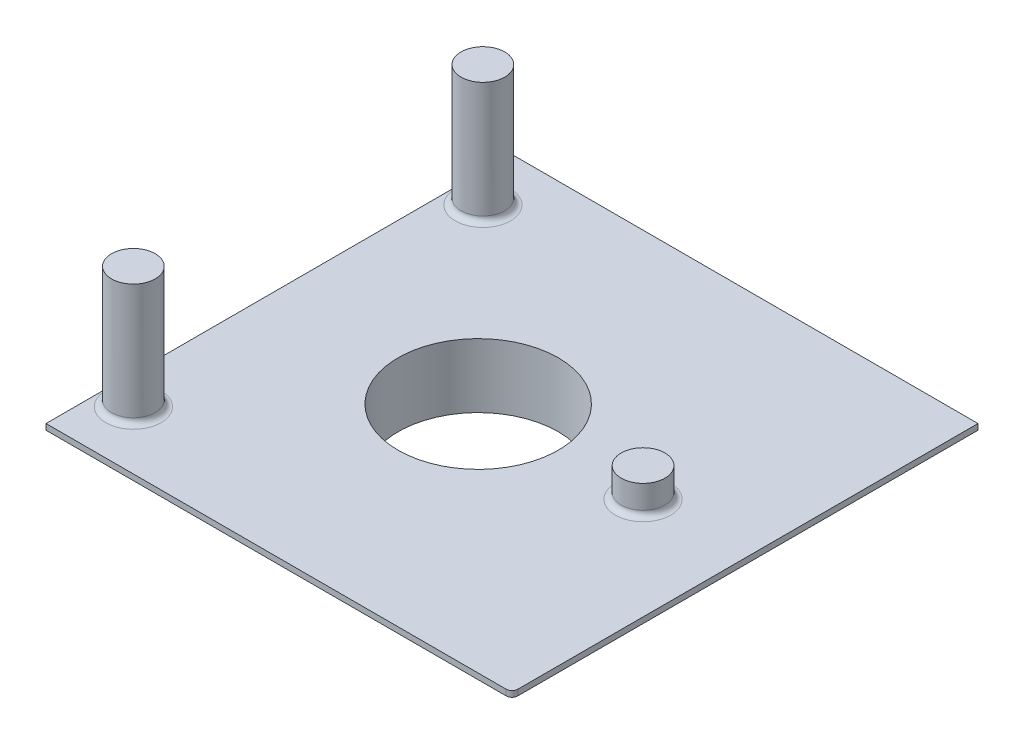
ISO-10303-21;
HEADER;
FILE_DESCRIPTION(('STEP AP214'),'2;1');
FILE_NAME('part.step','',(''),(''),'','','');
FILE_SCHEMA(('AUTOMOTIVE_DESIGN { 1 0 10303 214 1 1 1 1 }'));
ENDSEC;
DATA;
#1=APPLICATION_CONTEXT('core data for automotive mechanical design processes');
#2=APPLICATION_PROTOCOL_DEFINITION('international standard','automotive_design',2000,#1);
#3=PRODUCT_CONTEXT('',#1,'mechanical');
#4=PRODUCT('Part','Part','',(#3));
#5=PRODUCT_RELATED_PRODUCT_CATEGORY('part','',(#4));
#6=PRODUCT_DEFINITION_FORMATION('','',#4);
#7=PRODUCT_DEFINITION_CONTEXT('part definition',#1,'design');
#8=PRODUCT_DEFINITION('design','',#6,#7);
#9=PRODUCT_DEFINITION_SHAPE('','',#8);
#10=(LENGTH_UNIT() NAMED_UNIT(*) SI_UNIT(.MILLI.,.METRE.));
#11=(NAMED_UNIT(*) PLANE_ANGLE_UNIT() SI_UNIT($,.RADIAN.));
#12=(NAMED_UNIT(*) SI_UNIT($,.STERADIAN.) SOLID_ANGLE_UNIT());
#13=UNCERTAINTY_MEASURE_WITH_UNIT(LENGTH_MEASURE(1.E-05),#10,'distance_accuracy_value','');
#14=(GEOMETRIC_REPRESENTATION_CONTEXT(3) GLOBAL_UNCERTAINTY_ASSIGNED_CONTEXT((#13)) GLOBAL_UNIT_ASSIGNED_CONTEXT((#10,
#11,#12)) REPRESENTATION_CONTEXT('',''));
#15=CARTESIAN_POINT('',(0.,0.,0.));
#16=DIRECTION('',(0.,0.,1.));
#17=DIRECTION('',(1.,0.,0.));
#18=AXIS2_PLACEMENT_3D('',#15,#16,#17);
#19=CARTESIAN_POINT('',(0.,0.,0.));
#20=DIRECTION('',(0.,1.,0.));
#21=DIRECTION('',(0.,0.,1.));
#22=AXIS2_PLACEMENT_3D('',#19,#20,#21);
#23=PLANE('',#22);
#24=DIRECTION('',(0.,0.,-1.));
#25=VECTOR('',#24,1.);
#26=CARTESIAN_POINT('',(101.6,0.,-101.6));
#27=LINE('',#26,#25);
#28=CARTESIAN_POINT('',(101.6,0.,99.06));
#29=VERTEX_POINT('',#28);
#30=CARTESIAN_POINT('',(101.6,0.,-101.6));
#31=VERTEX_POINT('',#30);
#32=EDGE_CURVE('E105',#29,#31,#27,.T.);
#33=ORIENTED_EDGE('',*,*,#32,.F.);
#34=CARTESIAN_POINT('',(99.0600000000001,0.,99.06));
#35=DIRECTION('',(0.,1.,0.));
#36=DIRECTION('',(0.,0.,1.));
#37=AXIS2_PLACEMENT_3D('',#34,#35,#36);
#38=CIRCLE('',#37,2.54);
#39=CARTESIAN_POINT('',(99.06,0.,101.6));
#40=VERTEX_POINT('',#39);
#41=EDGE_CURVE('E57',#29,#40,#38,.F.);
#42=ORIENTED_EDGE('',*,*,#41,.T.);
#43=DIRECTION('',(1.,0.,0.));
#44=VECTOR('',#43,1.);
#45=CARTESIAN_POINT('',(-101.6,0.,101.6));
#46=LINE('',#45,#44);
#47=CARTESIAN_POINT('',(-101.6,0.,101.6));
#48=VERTEX_POINT('',#47);
#49=EDGE_CURVE('E93',#48,#40,#46,.T.);
#50=ORIENTED_EDGE('',*,*,#49,.F.);
#51=DIRECTION('',(0.,0.,1.));
#52=VECTOR('',#51,1.);
#53=CARTESIAN_POINT('',(-101.6,0.,-101.6));
#54=LINE('',#53,#52);
#55=CARTESIAN_POINT('',(-101.6,0.,-101.6));
#56=VERTEX_POINT('',#55);
#57=EDGE_CURVE('E187',#56,#48,#54,.T.);
#58=ORIENTED_EDGE('',*,*,#57,.F.);
#59=DIRECTION('',(-1.,0.,0.));
#60=VECTOR('',#59,1.);
#61=CARTESIAN_POINT('',(-101.6,0.,-101.6));
#62=LINE('',#61,#60);
#63=EDGE_CURVE('E184',#31,#56,#62,.T.);
#64=ORIENTED_EDGE('',*,*,#63,.F.);
#65=EDGE_LOOP('',(#33,#42,#50,#58,#64));
#66=FACE_BOUND('',#65,.T.);
#67=CARTESIAN_POINT('',(-14.7419850587649,0.,0.));
#68=DIRECTION('',(0.,1.,0.));
#69=DIRECTION('',(0.,0.,1.));
#70=AXIS2_PLACEMENT_3D('',#67,#68,#69);
#71=CIRCLE('',#70,40.005);
#72=CARTESIAN_POINT('',(-14.7419850587649,0.,40.005));
#73=VERTEX_POINT('',#72);
#74=EDGE_CURVE('E117',#73,#73,#71,.F.);
#75=ORIENTED_EDGE('',*,*,#74,.F.);
#76=EDGE_LOOP('',(#75));
#77=FACE_BOUND('',#76,.T.);
#78=ADVANCED_FACE('F34',(#66,#77),#23,.F.);
#79=CARTESIAN_POINT('',(101.6,2.54000000000004,-101.6));
#80=DIRECTION('',(-1.,0.,0.));
#81=DIRECTION('',(0.,0.,1.));
#82=AXIS2_PLACEMENT_3D('',#79,#80,#81);
#83=PLANE('',#82);
#84=DIRECTION('',(0.,0.,-1.));
#85=VECTOR('',#84,1.);
#86=CARTESIAN_POINT('',(101.6,2.54000000000004,-101.6));
#87=LINE('',#86,#85);
#88=CARTESIAN_POINT('',(101.6,2.54,99.06));
#89=VERTEX_POINT('',#88);
#90=CARTESIAN_POINT('',(101.6,2.54000000000004,-101.6));
#91=VERTEX_POINT('',#90);
#92=EDGE_CURVE('E82',#89,#91,#87,.T.);
#93=ORIENTED_EDGE('',*,*,#92,.F.);
#94=DIRECTION('',(0.,-1.,0.));
#95=VECTOR('',#94,1.);
#96=CARTESIAN_POINT('',(101.6,2.54,99.06));
#97=LINE('',#96,#95);
#98=EDGE_CURVE('E107',#89,#29,#97,.T.);
#99=ORIENTED_EDGE('',*,*,#98,.T.);
#100=ORIENTED_EDGE('',*,*,#32,.T.);
#101=DIRECTION('',(0.,-1.,0.));
#102=VECTOR('',#101,1.);
#103=CARTESIAN_POINT('',(101.6,2.54000000000004,-101.6));
#104=LINE('',#103,#102);
#105=EDGE_CURVE('E98',#91,#31,#104,.T.);
#106=ORIENTED_EDGE('',*,*,#105,.F.);
#107=EDGE_LOOP('',(#93,#99,#100,#106));
#108=FACE_BOUND('',#107,.T.);
#109=ADVANCED_FACE('F104',(#108),#83,.F.);
#110=CARTESIAN_POINT('',(-101.6,2.54000000000004,-101.6));
#111=DIRECTION('',(0.,0.,1.));
#112=DIRECTION('',(1.,0.,0.));
#113=AXIS2_PLACEMENT_3D('',#110,#111,#112);
#114=PLANE('',#113);
#115=ORIENTED_EDGE('',*,*,#63,.T.);
#116=DIRECTION('',(0.,-1.,0.));
#117=VECTOR('',#116,1.);
#118=CARTESIAN_POINT('',(-101.6,2.54000000000004,-101.6));
#119=LINE('',#118,#117);
#120=CARTESIAN_POINT('',(-101.6,2.54000000000004,-101.6));
#121=VERTEX_POINT('',#120);
#122=EDGE_CURVE('E100',#121,#56,#119,.T.);
#123=ORIENTED_EDGE('',*,*,#122,.F.);
#124=DIRECTION('',(-1.,0.,0.));
#125=VECTOR('',#124,1.);
#126=CARTESIAN_POINT('',(-101.6,2.54000000000004,-101.6));
#127=LINE('',#126,#125);
#128=EDGE_CURVE('E85',#91,#121,#127,.T.);
#129=ORIENTED_EDGE('',*,*,#128,.F.);
#130=ORIENTED_EDGE('',*,*,#105,.T.);
#131=EDGE_LOOP('',(#115,#123,#129,#130));
#132=FACE_BOUND('',#131,.T.);
#133=ADVANCED_FACE('F97',(#132),#114,.F.);
#134=CARTESIAN_POINT('',(-101.6,2.54000000000004,-101.6));
#135=DIRECTION('',(1.,0.,0.));
#136=DIRECTION('',(0.,0.,-1.));
#137=AXIS2_PLACEMENT_3D('',#134,#135,#136);
#138=PLANE('',#137);
#139=ORIENTED_EDGE('',*,*,#57,.T.);
#140=DIRECTION('',(0.,-1.,0.));
#141=VECTOR('',#140,1.);
#142=CARTESIAN_POINT('',(-101.6,2.54000000000004,101.6));
#143=LINE('',#142,#141);
#144=CARTESIAN_POINT('',(-101.6,2.54000000000004,101.6));
#145=VERTEX_POINT('',#144);
#146=EDGE_CURVE('E110',#145,#48,#143,.T.);
#147=ORIENTED_EDGE('',*,*,#146,.F.);
#148=DIRECTION('',(0.,0.,1.));
#149=VECTOR('',#148,1.);
#150=CARTESIAN_POINT('',(-101.6,2.54000000000004,-101.6));
#151=LINE('',#150,#149);
#152=EDGE_CURVE('E102',#121,#145,#151,.T.);
#153=ORIENTED_EDGE('',*,*,#152,.F.);
#154=ORIENTED_EDGE('',*,*,#122,.T.);
#155=EDGE_LOOP('',(#139,#147,#153,#154));
#156=FACE_BOUND('',#155,.T.);
#157=ADVANCED_FACE('F163',(#156),#138,.F.);
#158=CARTESIAN_POINT('',(-101.6,2.54000000000004,101.6));
#159=DIRECTION('',(0.,0.,-1.));
#160=DIRECTION('',(-1.,0.,0.));
#161=AXIS2_PLACEMENT_3D('',#158,#159,#160);
#162=PLANE('',#161);
#163=ORIENTED_EDGE('',*,*,#49,.T.);
#164=DIRECTION('',(0.,-1.,0.));
#165=VECTOR('',#164,1.);
#166=CARTESIAN_POINT('',(99.06,2.54,101.6));
#167=LINE('',#166,#165);
#168=CARTESIAN_POINT('',(99.06,2.54,101.6));
#169=VERTEX_POINT('',#168);
#170=EDGE_CURVE('E49',#40,#169,#167,.F.);
#171=ORIENTED_EDGE('',*,*,#170,.T.);
#172=DIRECTION('',(1.,0.,0.));
#173=VECTOR('',#172,1.);
#174=CARTESIAN_POINT('',(-101.6,2.54000000000004,101.6));
#175=LINE('',#174,#173);
#176=EDGE_CURVE('E193',#145,#169,#175,.T.);
#177=ORIENTED_EDGE('',*,*,#176,.F.);
#178=ORIENTED_EDGE('',*,*,#146,.T.);
#179=EDGE_LOOP('',(#163,#171,#177,#178));
#180=FACE_BOUND('',#179,.T.);
#181=ADVANCED_FACE('F160',(#180),#162,.F.);
#182=CARTESIAN_POINT('',(0.,2.54,0.));
#183=DIRECTION('',(0.,1.,0.));
#184=DIRECTION('',(0.,0.,1.));
#185=AXIS2_PLACEMENT_3D('',#182,#183,#184);
#186=PLANE('',#185);
#187=CARTESIAN_POINT('',(57.15,2.54,0.));
#188=DIRECTION('',(0.,1.,0.));
#189=DIRECTION('',(0.,0.,1.));
#190=AXIS2_PLACEMENT_3D('',#187,#188,#189);
#191=CIRCLE('',#190,12.065);
#192=CARTESIAN_POINT('',(57.15,2.54,12.065));
#193=VERTEX_POINT('',#192);
#194=EDGE_CURVE('E129',#193,#193,#191,.F.);
#195=ORIENTED_EDGE('',*,*,#194,.T.);
#196=EDGE_LOOP('',(#195));
#197=FACE_BOUND('',#196,.T.);
#198=CARTESIAN_POINT('',(-88.9,2.54,-76.1999999999998));
#199=DIRECTION('',(0.,1.,0.));
#200=DIRECTION('',(0.,0.,1.));
#201=AXIS2_PLACEMENT_3D('',#198,#199,#200);
#202=CIRCLE('',#201,12.065);
#203=CARTESIAN_POINT('',(-88.9,2.54,-64.1349999999998));
#204=VERTEX_POINT('',#203);
#205=EDGE_CURVE('E126',#204,#204,#202,.F.);
#206=ORIENTED_EDGE('',*,*,#205,.T.);
#207=EDGE_LOOP('',(#206));
#208=FACE_BOUND('',#207,.T.);
#209=CARTESIAN_POINT('',(-88.8999999999999,2.54000000000004,76.2));
#210=DIRECTION('',(0.,1.,0.));
#211=DIRECTION('',(0.,0.,1.));
#212=AXIS2_PLACEMENT_3D('',#209,#210,#211);
#213=CIRCLE('',#212,12.065);
#214=CARTESIAN_POINT('',(-88.8999999999999,2.54000000000004,88.2650000000001));
#215=VERTEX_POINT('',#214);
#216=EDGE_CURVE('E123',#215,#215,#213,.F.);
#217=ORIENTED_EDGE('',*,*,#216,.T.);
#218=EDGE_LOOP('',(#217));
#219=FACE_BOUND('',#218,.T.);
#220=CARTESIAN_POINT('',(-14.7419850587649,2.54,0.));
#221=DIRECTION('',(0.,1.,0.));
#222=DIRECTION('',(0.,0.,1.));
#223=AXIS2_PLACEMENT_3D('',#220,#221,#222);
#224=CIRCLE('',#223,34.925);
#225=CARTESIAN_POINT('',(-14.7419850587649,2.54,34.925));
#226=VERTEX_POINT('',#225);
#227=EDGE_CURVE('E190',#226,#226,#224,.T.);
#228=ORIENTED_EDGE('',*,*,#227,.F.);
#229=EDGE_LOOP('',(#228));
#230=FACE_BOUND('',#229,.T.);
#231=ORIENTED_EDGE('',*,*,#176,.T.);
#232=CARTESIAN_POINT('',(99.0600000000001,2.54,99.06));
#233=DIRECTION('',(0.,1.,0.));
#234=DIRECTION('',(0.,0.,1.));
#235=AXIS2_PLACEMENT_3D('',#232,#233,#234);
#236=CIRCLE('',#235,2.54);
#237=EDGE_CURVE('E88',#169,#89,#236,.T.);
#238=ORIENTED_EDGE('',*,*,#237,.T.);
#239=ORIENTED_EDGE('',*,*,#92,.T.);
#240=ORIENTED_EDGE('',*,*,#128,.T.);
#241=ORIENTED_EDGE('',*,*,#152,.T.);
#242=EDGE_LOOP('',(#231,#238,#239,#240,#241));
#243=FACE_BOUND('',#242,.T.);
#244=ADVANCED_FACE('F84',(#197,#208,#219,#230,#243),#186,.T.);
#245=CARTESIAN_POINT('',(57.15,15.24,0.));
#246=DIRECTION('',(0.,-1.,0.));
#247=DIRECTION('',(0.,0.,-1.));
#248=AXIS2_PLACEMENT_3D('',#245,#246,#247);
#249=CYLINDRICAL_SURFACE('',#248,9.525);
#250=CARTESIAN_POINT('',(57.15,5.08,0.));
#251=DIRECTION('',(0.,1.,0.));
#252=DIRECTION('',(0.,0.,1.));
#253=AXIS2_PLACEMENT_3D('',#250,#251,#252);
#254=CIRCLE('',#253,9.525);
#255=CARTESIAN_POINT('',(57.15,5.08,9.525));
#256=VERTEX_POINT('',#255);
#257=EDGE_CURVE('E120',#256,#256,#254,.T.);
#258=ORIENTED_EDGE('',*,*,#257,.T.);
#259=EDGE_LOOP('',(#258));
#260=FACE_BOUND('',#259,.T.);
#261=CARTESIAN_POINT('',(57.15,15.24,0.));
#262=DIRECTION('',(0.,1.,0.));
#263=DIRECTION('',(0.,0.,1.));
#264=AXIS2_PLACEMENT_3D('',#261,#262,#263);
#265=CIRCLE('',#264,9.525);
#266=CARTESIAN_POINT('',(57.15,15.24,9.525));
#267=VERTEX_POINT('',#266);
#268=EDGE_CURVE('E185',#267,#267,#265,.T.);
#269=ORIENTED_EDGE('',*,*,#268,.F.);
#270=EDGE_LOOP('',(#269));
#271=FACE_BOUND('',#270,.T.);
#272=ADVANCED_FACE('F227',(#260,#271),#249,.T.);
#273=CARTESIAN_POINT('',(57.15,15.24,0.));
#274=DIRECTION('',(0.,1.,0.));
#275=DIRECTION('',(0.,0.,1.));
#276=AXIS2_PLACEMENT_3D('',#273,#274,#275);
#277=PLANE('',#276);
#278=ORIENTED_EDGE('',*,*,#268,.T.);
#279=EDGE_LOOP('',(#278));
#280=FACE_BOUND('',#279,.T.);
#281=ADVANCED_FACE('F218',(#280),#277,.T.);
#282=CARTESIAN_POINT('',(-14.7419850587649,0.,0.));
#283=DIRECTION('',(0.,1.,0.));
#284=DIRECTION('',(0.,0.,1.));
#285=AXIS2_PLACEMENT_3D('',#282,#283,#284);
#286=CYLINDRICAL_SURFACE('',#285,34.925);
#287=ORIENTED_EDGE('',*,*,#227,.T.);
#288=EDGE_LOOP('',(#287));
#289=FACE_BOUND('',#288,.T.);
#290=CARTESIAN_POINT('',(-14.7419850587649,-25.3999999999999,0.));
#291=DIRECTION('',(0.,-1.,0.));
#292=DIRECTION('',(0.,0.,-1.));
#293=AXIS2_PLACEMENT_3D('',#290,#291,#292);
#294=CIRCLE('',#293,34.925);
#295=CARTESIAN_POINT('',(-14.7419850587649,-25.3999999999999,-34.925));
#296=VERTEX_POINT('',#295);
#297=EDGE_CURVE('E211',#296,#296,#294,.T.);
#298=ORIENTED_EDGE('',*,*,#297,.T.);
#299=EDGE_LOOP('',(#298));
#300=FACE_BOUND('',#299,.T.);
#301=ADVANCED_FACE('F215',(#289,#300),#286,.F.);
#302=CARTESIAN_POINT('',(-88.9,138.065768363207,-76.2));
#303=DIRECTION('',(0.,-1.,0.));
#304=DIRECTION('',(0.,0.,-1.));
#305=AXIS2_PLACEMENT_3D('',#302,#303,#304);
#306=CYLINDRICAL_SURFACE('',#305,9.52500000000001);
#307=CARTESIAN_POINT('',(-88.9,5.08,-76.1999999999998));
#308=DIRECTION('',(0.,1.,0.));
#309=DIRECTION('',(0.,0.,1.));
#310=AXIS2_PLACEMENT_3D('',#307,#308,#309);
#311=CIRCLE('',#310,9.52500000000001);
#312=CARTESIAN_POINT('',(-88.9,5.08,-85.7250000000001));
#313=VERTEX_POINT('',#312);
#314=EDGE_CURVE('E42',#313,#313,#311,.T.);
#315=CARTESIAN_POINT('',(-88.9,55.5625,-76.2));
#316=DIRECTION('',(0.,1.,0.));
#317=DIRECTION('',(0.,0.,1.));
#318=AXIS2_PLACEMENT_3D('',#315,#316,#317);
#319=CIRCLE('',#318,9.52500000000001);
#320=CARTESIAN_POINT('',(-88.9,55.5625,-85.7250000000001));
#321=VERTEX_POINT('',#320);
#322=EDGE_CURVE('E202',#321,#321,#319,.T.);
#323=CARTESIAN_POINT('',(-88.9,5.08,-85.7250000000001));
#324=CARTESIAN_POINT('',(-88.9,5.605859375,-85.7250000000001));
#325=CARTESIAN_POINT('',(-88.9,6.13171875000001,-85.7250000000001));
#326=CARTESIAN_POINT('',(-88.9,7.18343750000001,-85.7250000000001));
#327=CARTESIAN_POINT('',(-88.9,7.70929687500001,-85.7250000000001));
#328=CARTESIAN_POINT('',(-88.9,8.76101562500001,-85.7250000000001));
#329=CARTESIAN_POINT('',(-88.9,9.286875,-85.7250000000001));
#330=CARTESIAN_POINT('',(-88.9,10.33859375,-85.7250000000001));
#331=CARTESIAN_POINT('',(-88.9,10.864453125,-85.7250000000001));
#332=CARTESIAN_POINT('',(-88.9,11.916171875,-85.7250000000001));
#333=CARTESIAN_POINT('',(-88.9,12.44203125,-85.7250000000001));
#334=CARTESIAN_POINT('',(-88.9,13.49375,-85.7250000000001));
#335=CARTESIAN_POINT('',(-88.9,14.019609375,-85.7250000000001));
#336=CARTESIAN_POINT('',(-88.9,15.071328125,-85.7250000000001));
#337=CARTESIAN_POINT('',(-88.9,15.5971875,-85.7250000000001));
#338=CARTESIAN_POINT('',(-88.9,16.64890625,-85.7250000000001));
#339=CARTESIAN_POINT('',(-88.9,17.174765625,-85.7250000000001));
#340=CARTESIAN_POINT('',(-88.9,18.226484375,-85.7250000000001));
#341=CARTESIAN_POINT('',(-88.9,18.75234375,-85.7250000000001));
#342=CARTESIAN_POINT('',(-88.9,19.8040625,-85.7250000000001));
#343=CARTESIAN_POINT('',(-88.9,20.329921875,-85.7250000000001));
#344=CARTESIAN_POINT('',(-88.9,21.381640625,-85.7250000000001));
#345=CARTESIAN_POINT('',(-88.9,21.9075,-85.7250000000001));
#346=CARTESIAN_POINT('',(-88.9,22.95921875,-85.7250000000001));
#347=CARTESIAN_POINT('',(-88.9,23.485078125,-85.7250000000001));
#348=CARTESIAN_POINT('',(-88.9,24.536796875,-85.7250000000001));
#349=CARTESIAN_POINT('',(-88.9,25.06265625,-85.7250000000001));
#350=CARTESIAN_POINT('',(-88.9,26.114375,-85.7250000000001));
#351=CARTESIAN_POINT('',(-88.9,26.640234375,-85.7250000000001));
#352=CARTESIAN_POINT('',(-88.9,27.691953125,-85.7250000000001));
#353=CARTESIAN_POINT('',(-88.9,28.2178125,-85.7250000000001));
#354=CARTESIAN_POINT('',(-88.9,29.26953125,-85.7250000000001));
#355=CARTESIAN_POINT('',(-88.9,29.795390625,-85.7250000000001));
#356=CARTESIAN_POINT('',(-88.9,30.847109375,-85.7250000000001));
#357=CARTESIAN_POINT('',(-88.9,31.37296875,-85.7250000000001));
#358=CARTESIAN_POINT('',(-88.9,32.4246875,-85.7250000000001));
#359=CARTESIAN_POINT('',(-88.9,32.950546875,-85.7250000000001));
#360=CARTESIAN_POINT('',(-88.9,34.002265625,-85.7250000000001));
#361=CARTESIAN_POINT('',(-88.9,34.528125,-85.7250000000001));
#362=CARTESIAN_POINT('',(-88.9,35.57984375,-85.7250000000001));
#363=CARTESIAN_POINT('',(-88.9,36.105703125,-85.7250000000001));
#364=CARTESIAN_POINT('',(-88.9,37.157421875,-85.7250000000001));
#365=CARTESIAN_POINT('',(-88.9,37.68328125,-85.7250000000001));
#366=CARTESIAN_POINT('',(-88.9,38.735,-85.7250000000001));
#367=CARTESIAN_POINT('',(-88.9,39.260859375,-85.7250000000001));
#368=CARTESIAN_POINT('',(-88.9,40.312578125,-85.7250000000001));
#369=CARTESIAN_POINT('',(-88.9,40.8384375,-85.7250000000001));
#370=CARTESIAN_POINT('',(-88.9,41.89015625,-85.7250000000001));
#371=CARTESIAN_POINT('',(-88.9,42.416015625,-85.7250000000001));
#372=CARTESIAN_POINT('',(-88.9,43.467734375,-85.7250000000001));
#373=CARTESIAN_POINT('',(-88.9,43.99359375,-85.7250000000001));
#374=CARTESIAN_POINT('',(-88.9,45.0453125,-85.7250000000001));
#375=CARTESIAN_POINT('',(-88.9,45.571171875,-85.7250000000001));
#376=CARTESIAN_POINT('',(-88.9,46.622890625,-85.7250000000001));
#377=CARTESIAN_POINT('',(-88.9,47.14875,-85.7250000000001));
#378=CARTESIAN_POINT('',(-88.9,48.20046875,-85.7250000000001));
#379=CARTESIAN_POINT('',(-88.9,48.726328125,-85.7250000000001));
#380=CARTESIAN_POINT('',(-88.9,49.778046875,-85.7250000000001));
#381=CARTESIAN_POINT('',(-88.9,50.30390625,-85.7250000000001));
#382=CARTESIAN_POINT('',(-88.9,51.355625,-85.7250000000001));
#383=CARTESIAN_POINT('',(-88.9,51.881484375,-85.7250000000001));
#384=CARTESIAN_POINT('',(-88.9,52.933203125,-85.7250000000001));
#385=CARTESIAN_POINT('',(-88.9,53.4590625,-85.7250000000001));
#386=CARTESIAN_POINT('',(-88.9,54.51078125,-85.7250000000001));
#387=CARTESIAN_POINT('',(-88.9,55.036640625,-85.7250000000001));
#388=CARTESIAN_POINT('',(-88.9,55.5625,-85.7250000000001));
#389=B_SPLINE_CURVE_WITH_KNOTS('',3,(#323,#324,#325,#326,#327,#328,#329,#330,#331,#332,#333,
#334,#335,#336,#337,#338,#339,#340,#341,#342,#343,#344,#345,#346,#347,#348,#349,#350,#351,#352,
#353,#354,#355,#356,#357,#358,#359,#360,#361,#362,#363,#364,#365,#366,#367,#368,#369,#370,#371,
#372,#373,#374,#375,#376,#377,#378,#379,#380,#381,#382,#383,#384,#385,#386,#387,#388),
.UNSPECIFIED.,.F.,.F.,(4,2,2,2,2,2,2,2,2,2,2,2,2,2,2,2,2,2,2,2,2,2,2,2,2,2,2,2,2,2,2,2,4),(0.,
1.57757812500001,3.15515625000001,4.73273437499999,6.3103125,7.887890625,9.46546875,
11.043046875,12.620625,14.198203125,15.77578125,17.353359375,18.9309375,20.508515625,
22.08609375,23.663671875,25.24125,26.818828125,28.39640625,29.973984375,31.5515625,33.129140625,
34.70671875,36.284296875,37.861875,39.439453125,41.01703125,42.594609375,44.1721875,
45.749765625,47.32734375,48.904921875,50.4825),.UNSPECIFIED.);
#390=EDGE_CURVE('BSEAM134',#313,#321,#389,.T.);
#391=ORIENTED_EDGE('',*,*,#314,.T.);
#392=ORIENTED_EDGE('',*,*,#322,.F.);
#393=ORIENTED_EDGE('',*,*,#390,.T.);
#394=ORIENTED_EDGE('',*,*,#390,.F.);
#395=EDGE_LOOP('',(#391,#393,#392,#394));
#396=FACE_BOUND('',#395,.T.);
#397=ADVANCED_FACE('F134',(#396),#306,.T.);
#398=CARTESIAN_POINT('',(0.,55.5625,-3.33066907387547E-13));
#399=DIRECTION('',(0.,1.,0.));
#400=DIRECTION('',(0.,0.,1.));
#401=AXIS2_PLACEMENT_3D('',#398,#399,#400);
#402=PLANE('',#401);
#403=ORIENTED_EDGE('',*,*,#322,.T.);
#404=EDGE_LOOP('',(#403));
#405=FACE_BOUND('',#404,.T.);
#406=ADVANCED_FACE('F225',(#405),#402,.T.);
#407=CARTESIAN_POINT('',(0.,55.5625,-3.33066907387547E-13));
#408=DIRECTION('',(0.,1.,0.));
#409=DIRECTION('',(0.,0.,1.));
#410=AXIS2_PLACEMENT_3D('',#407,#408,#409);
#411=PLANE('',#410);
#412=CARTESIAN_POINT('',(-88.9,55.5625,76.2));
#413=DIRECTION('',(0.,1.,0.));
#414=DIRECTION('',(0.,0.,1.));
#415=AXIS2_PLACEMENT_3D('',#412,#413,#414);
#416=CIRCLE('',#415,9.52500000000001);
#417=CARTESIAN_POINT('',(-88.8999999999999,55.5625,66.6749999999999));
#418=VERTEX_POINT('',#417);
#419=EDGE_CURVE('E205',#418,#418,#416,.F.);
#420=ORIENTED_EDGE('',*,*,#419,.F.);
#421=EDGE_LOOP('',(#420));
#422=FACE_BOUND('',#421,.T.);
#423=ADVANCED_FACE('F180',(#422),#411,.T.);
#424=CARTESIAN_POINT('',(-88.8999999999999,138.065768363207,76.1999999999999));
#425=DIRECTION('',(0.,-1.,0.));
#426=DIRECTION('',(0.,0.,-1.));
#427=AXIS2_PLACEMENT_3D('',#424,#425,#426);
#428=CYLINDRICAL_SURFACE('',#427,9.52500000000001);
#429=CARTESIAN_POINT('',(-88.9,5.08000000000004,76.2));
#430=DIRECTION('',(0.,1.,0.));
#431=DIRECTION('',(0.,0.,1.));
#432=AXIS2_PLACEMENT_3D('',#429,#430,#431);
#433=CIRCLE('',#432,9.52500000000001);
#434=CARTESIAN_POINT('',(-88.8999999999999,5.08000000000006,66.6749999999999));
#435=VERTEX_POINT('',#434);
#436=EDGE_CURVE('E12',#435,#435,#433,.T.);
#437=CARTESIAN_POINT('',(-88.8999999999999,5.08000000000006,66.6749999999999));
#438=CARTESIAN_POINT('',(-88.8999999999999,5.60585937500006,66.6749999999999));
#439=CARTESIAN_POINT('',(-88.8999999999999,6.13171875000006,66.6749999999999));
#440=CARTESIAN_POINT('',(-88.8999999999999,7.18343750000007,66.6749999999999));
#441=CARTESIAN_POINT('',(-88.8999999999999,7.70929687500007,66.6749999999999));
#442=CARTESIAN_POINT('',(-88.8999999999999,8.76101562500006,66.6749999999999));
#443=CARTESIAN_POINT('',(-88.8999999999999,9.28687500000006,66.6749999999999));
#444=CARTESIAN_POINT('',(-88.8999999999999,10.3385937500001,66.6749999999999));
#445=CARTESIAN_POINT('',(-88.8999999999999,10.8644531250001,66.6749999999999));
#446=CARTESIAN_POINT('',(-88.8999999999999,11.9161718750001,66.6749999999999));
#447=CARTESIAN_POINT('',(-88.8999999999999,12.4420312500001,66.6749999999999));
#448=CARTESIAN_POINT('',(-88.8999999999999,13.4937500000001,66.6749999999999));
#449=CARTESIAN_POINT('',(-88.8999999999999,14.019609375,66.6749999999999));
#450=CARTESIAN_POINT('',(-88.8999999999999,15.071328125,66.6749999999999));
#451=CARTESIAN_POINT('',(-88.8999999999999,15.5971875,66.6749999999999));
#452=CARTESIAN_POINT('',(-88.8999999999999,16.64890625,66.6749999999999));
#453=CARTESIAN_POINT('',(-88.8999999999999,17.174765625,66.6749999999999));
#454=CARTESIAN_POINT('',(-88.8999999999999,18.226484375,66.6749999999999));
#455=CARTESIAN_POINT('',(-88.8999999999999,18.75234375,66.6749999999999));
#456=CARTESIAN_POINT('',(-88.8999999999999,19.8040625,66.6749999999999));
#457=CARTESIAN_POINT('',(-88.8999999999999,20.329921875,66.6749999999999));
#458=CARTESIAN_POINT('',(-88.8999999999999,21.381640625,66.6749999999999));
#459=CARTESIAN_POINT('',(-88.8999999999999,21.9075,66.6749999999999));
#460=CARTESIAN_POINT('',(-88.8999999999999,22.95921875,66.6749999999999));
#461=CARTESIAN_POINT('',(-88.8999999999999,23.485078125,66.6749999999999));
#462=CARTESIAN_POINT('',(-88.8999999999999,24.536796875,66.6749999999999));
#463=CARTESIAN_POINT('',(-88.8999999999999,25.06265625,66.6749999999999));
#464=CARTESIAN_POINT('',(-88.8999999999999,26.114375,66.6749999999999));
#465=CARTESIAN_POINT('',(-88.8999999999999,26.640234375,66.6749999999999));
#466=CARTESIAN_POINT('',(-88.8999999999999,27.691953125,66.6749999999999));
#467=CARTESIAN_POINT('',(-88.8999999999999,28.2178125,66.6749999999999));
#468=CARTESIAN_POINT('',(-88.8999999999999,29.26953125,66.6749999999999));
#469=CARTESIAN_POINT('',(-88.8999999999999,29.795390625,66.6749999999999));
#470=CARTESIAN_POINT('',(-88.8999999999999,30.847109375,66.6749999999999));
#471=CARTESIAN_POINT('',(-88.8999999999999,31.37296875,66.6749999999999));
#472=CARTESIAN_POINT('',(-88.8999999999999,32.4246875,66.6749999999999));
#473=CARTESIAN_POINT('',(-88.8999999999999,32.950546875,66.6749999999999));
#474=CARTESIAN_POINT('',(-88.8999999999999,34.002265625,66.6749999999999));
#475=CARTESIAN_POINT('',(-88.8999999999999,34.528125,66.6749999999999));
#476=CARTESIAN_POINT('',(-88.8999999999999,35.57984375,66.6749999999999));
#477=CARTESIAN_POINT('',(-88.8999999999999,36.105703125,66.6749999999999));
#478=CARTESIAN_POINT('',(-88.8999999999999,37.157421875,66.6749999999999));
#479=CARTESIAN_POINT('',(-88.8999999999999,37.68328125,66.6749999999999));
#480=CARTESIAN_POINT('',(-88.8999999999999,38.735,66.6749999999999));
#481=CARTESIAN_POINT('',(-88.8999999999999,39.260859375,66.6749999999999));
#482=CARTESIAN_POINT('',(-88.8999999999999,40.312578125,66.6749999999999));
#483=CARTESIAN_POINT('',(-88.8999999999999,40.8384375,66.6749999999999));
#484=CARTESIAN_POINT('',(-88.8999999999999,41.89015625,66.6749999999999));
#485=CARTESIAN_POINT('',(-88.8999999999999,42.416015625,66.6749999999999));
#486=CARTESIAN_POINT('',(-88.8999999999999,43.467734375,66.6749999999999));
#487=CARTESIAN_POINT('',(-88.8999999999999,43.99359375,66.6749999999999));
#488=CARTESIAN_POINT('',(-88.8999999999999,45.0453125,66.6749999999999));
#489=CARTESIAN_POINT('',(-88.8999999999999,45.571171875,66.6749999999999));
#490=CARTESIAN_POINT('',(-88.8999999999999,46.622890625,66.6749999999999));
#491=CARTESIAN_POINT('',(-88.8999999999999,47.14875,66.6749999999999));
#492=CARTESIAN_POINT('',(-88.8999999999999,48.20046875,66.6749999999999));
#493=CARTESIAN_POINT('',(-88.8999999999999,48.726328125,66.6749999999999));
#494=CARTESIAN_POINT('',(-88.8999999999999,49.778046875,66.6749999999999));
#495=CARTESIAN_POINT('',(-88.8999999999999,50.30390625,66.6749999999999));
#496=CARTESIAN_POINT('',(-88.8999999999999,51.355625,66.6749999999999));
#497=CARTESIAN_POINT('',(-88.8999999999999,51.881484375,66.6749999999999));
#498=CARTESIAN_POINT('',(-88.8999999999999,52.933203125,66.6749999999999));
#499=CARTESIAN_POINT('',(-88.8999999999999,53.4590625,66.6749999999999));
#500=CARTESIAN_POINT('',(-88.8999999999999,54.51078125,66.6749999999999));
#501=CARTESIAN_POINT('',(-88.8999999999999,55.036640625,66.6749999999999));
#502=CARTESIAN_POINT('',(-88.8999999999999,55.5625,66.6749999999999));
#503=B_SPLINE_CURVE_WITH_KNOTS('',3,(#437,#438,#439,#440,#441,#442,#443,#444,#445,#446,#447,
#448,#449,#450,#451,#452,#453,#454,#455,#456,#457,#458,#459,#460,#461,#462,#463,#464,#465,#466,
#467,#468,#469,#470,#471,#472,#473,#474,#475,#476,#477,#478,#479,#480,#481,#482,#483,#484,#485,
#486,#487,#488,#489,#490,#491,#492,#493,#494,#495,#496,#497,#498,#499,#500,#501,#502),
.UNSPECIFIED.,.F.,.F.,(4,2,2,2,2,2,2,2,2,2,2,2,2,2,2,2,2,2,2,2,2,2,2,2,2,2,2,2,2,2,2,2,4),(0.,
1.57757812500001,3.15515625000001,4.73273437499999,6.3103125,7.887890625,9.46546874999998,
11.043046875,12.620625,14.198203125,15.77578125,17.353359375,18.9309375,20.508515625,
22.08609375,23.663671875,25.24125,26.818828125,28.39640625,29.973984375,31.5515625,33.129140625,
34.70671875,36.284296875,37.861875,39.439453125,41.01703125,42.594609375,44.1721875,
45.749765625,47.32734375,48.904921875,50.4825),.UNSPECIFIED.);
#504=EDGE_CURVE('BSEAM172',#435,#418,#503,.T.);
#505=ORIENTED_EDGE('',*,*,#436,.T.);
#506=ORIENTED_EDGE('',*,*,#419,.T.);
#507=ORIENTED_EDGE('',*,*,#504,.T.);
#508=ORIENTED_EDGE('',*,*,#504,.F.);
#509=EDGE_LOOP('',(#505,#507,#506,#508));
#510=FACE_BOUND('',#509,.T.);
#511=ADVANCED_FACE('F172',(#510),#428,.T.);
#512=CARTESIAN_POINT('',(99.0600000000001,2.54,99.06));
#513=DIRECTION('',(0.,-1.,0.));
#514=DIRECTION('',(0.,0.,-1.));
#515=AXIS2_PLACEMENT_3D('',#512,#513,#514);
#516=CYLINDRICAL_SURFACE('',#515,2.54);
#517=ORIENTED_EDGE('',*,*,#237,.F.);
#518=ORIENTED_EDGE('',*,*,#170,.F.);
#519=ORIENTED_EDGE('',*,*,#41,.F.);
#520=ORIENTED_EDGE('',*,*,#98,.F.);
#521=EDGE_LOOP('',(#517,#518,#519,#520));
#522=FACE_BOUND('',#521,.T.);
#523=ADVANCED_FACE('F169',(#522),#516,.T.);
#524=CARTESIAN_POINT('',(-14.7419850587649,-25.3999999999999,0.));
#525=DIRECTION('',(0.,-1.,0.));
#526=DIRECTION('',(0.,0.,-1.));
#527=AXIS2_PLACEMENT_3D('',#524,#525,#526);
#528=PLANE('',#527);
#529=CARTESIAN_POINT('',(-14.7419850587649,-25.3999999999999,0.));
#530=DIRECTION('',(0.,-1.,0.));
#531=DIRECTION('',(0.,0.,-1.));
#532=AXIS2_PLACEMENT_3D('',#529,#530,#531);
#533=CIRCLE('',#532,40.005);
#534=CARTESIAN_POINT('',(-14.7419850587649,-25.3999999999999,-40.005));
#535=VERTEX_POINT('',#534);
#536=EDGE_CURVE('E208',#535,#535,#533,.T.);
#537=ORIENTED_EDGE('',*,*,#536,.T.);
#538=EDGE_LOOP('',(#537));
#539=FACE_BOUND('',#538,.T.);
#540=ORIENTED_EDGE('',*,*,#297,.F.);
#541=EDGE_LOOP('',(#540));
#542=FACE_BOUND('',#541,.T.);
#543=ADVANCED_FACE('F171',(#539,#542),#528,.T.);
#544=CARTESIAN_POINT('',(-14.7419850587649,-25.3999999999999,0.));
#545=DIRECTION('',(0.,1.,0.));
#546=DIRECTION('',(0.,0.,1.));
#547=AXIS2_PLACEMENT_3D('',#544,#545,#546);
#548=CYLINDRICAL_SURFACE('',#547,40.005);
#549=ORIENTED_EDGE('',*,*,#536,.F.);
#550=EDGE_LOOP('',(#549));
#551=FACE_BOUND('',#550,.T.);
#552=ORIENTED_EDGE('',*,*,#74,.T.);
#553=EDGE_LOOP('',(#552));
#554=FACE_BOUND('',#553,.T.);
#555=ADVANCED_FACE('F146',(#551,#554),#548,.T.);
#556=CARTESIAN_POINT('',(57.15,5.08,0.));
#557=DIRECTION('',(0.,1.,0.));
#558=DIRECTION('',(0.,0.,1.));
#559=AXIS2_PLACEMENT_3D('',#556,#557,#558);
#560=TOROIDAL_SURFACE('',#559,12.065,2.54);
#561=ORIENTED_EDGE('',*,*,#194,.F.);
#562=EDGE_LOOP('',(#561));
#563=FACE_BOUND('',#562,.T.);
#564=ORIENTED_EDGE('',*,*,#257,.F.);
#565=EDGE_LOOP('',(#564));
#566=FACE_BOUND('',#565,.T.);
#567=ADVANCED_FACE('F139',(#563,#566),#560,.F.);
#568=CARTESIAN_POINT('',(-88.9,5.08,-76.1999999999998));
#569=DIRECTION('',(0.,1.,0.));
#570=DIRECTION('',(0.,0.,1.));
#571=AXIS2_PLACEMENT_3D('',#568,#569,#570);
#572=TOROIDAL_SURFACE('',#571,12.065,2.54);
#573=ORIENTED_EDGE('',*,*,#205,.F.);
#574=EDGE_LOOP('',(#573));
#575=FACE_BOUND('',#574,.T.);
#576=ORIENTED_EDGE('',*,*,#314,.F.);
#577=EDGE_LOOP('',(#576));
#578=FACE_BOUND('',#577,.T.);
#579=ADVANCED_FACE('F137',(#575,#578),#572,.F.);
#580=CARTESIAN_POINT('',(-88.9,5.08000000000004,76.2));
#581=DIRECTION('',(0.,1.,0.));
#582=DIRECTION('',(0.,0.,1.));
#583=AXIS2_PLACEMENT_3D('',#580,#581,#582);
#584=TOROIDAL_SURFACE('',#583,12.065,2.54);
#585=ORIENTED_EDGE('',*,*,#216,.F.);
#586=EDGE_LOOP('',(#585));
#587=FACE_BOUND('',#586,.T.);
#588=ORIENTED_EDGE('',*,*,#436,.F.);
#589=EDGE_LOOP('',(#588));
#590=FACE_BOUND('',#589,.T.);
#591=ADVANCED_FACE('F36',(#587,#590),#584,.F.);
#592=CLOSED_SHELL('',(#78,#109,#133,#157,#181,#244,#272,#281,#301,#397,#406,#423,#511,#523,#543,
#555,#567,#579,#591));
#593=MANIFOLD_SOLID_BREP('B2',#592);
#594=ADVANCED_BREP_SHAPE_REPRESENTATION('',(#18,#593),#14);
#595=SHAPE_DEFINITION_REPRESENTATION(#9,#594);
ENDSEC;
END-ISO-10303-21;
